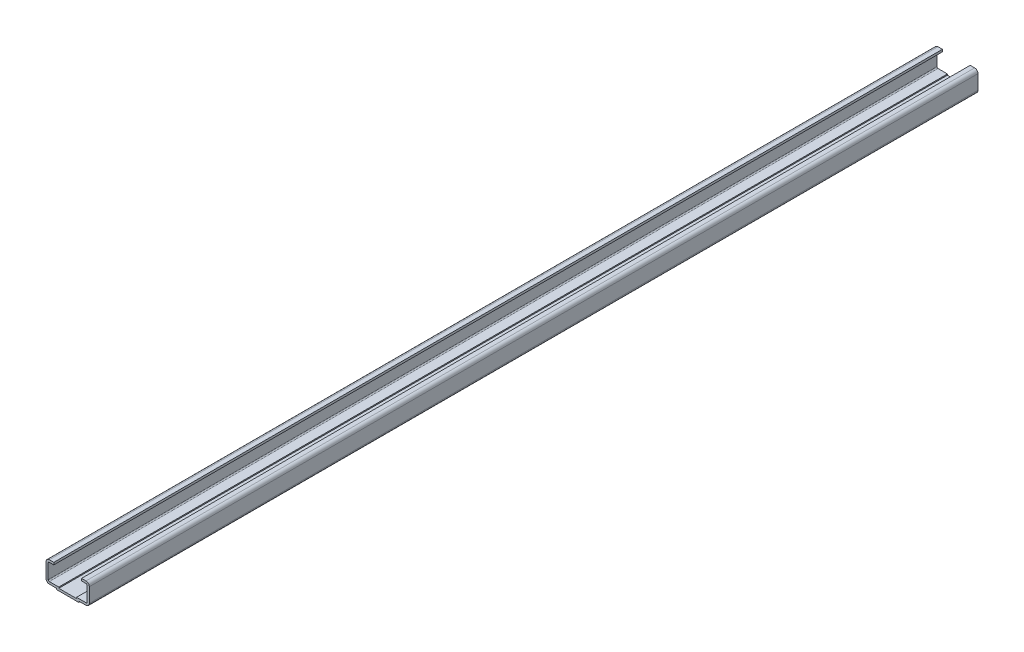
ISO-10303-21;
HEADER;
FILE_DESCRIPTION(('STEP AP214'),'2;1');
FILE_NAME('part.step','',(''),(''),'','','');
FILE_SCHEMA(('AUTOMOTIVE_DESIGN { 1 0 10303 214 1 1 1 1 }'));
ENDSEC;
DATA;
#1=APPLICATION_CONTEXT('core data for automotive mechanical design processes');
#2=APPLICATION_PROTOCOL_DEFINITION('international standard','automotive_design',2000,#1);
#3=PRODUCT_CONTEXT('',#1,'mechanical');
#4=PRODUCT('Part','Part','',(#3));
#5=PRODUCT_RELATED_PRODUCT_CATEGORY('part','',(#4));
#6=PRODUCT_DEFINITION_FORMATION('','',#4);
#7=PRODUCT_DEFINITION_CONTEXT('part definition',#1,'design');
#8=PRODUCT_DEFINITION('design','',#6,#7);
#9=PRODUCT_DEFINITION_SHAPE('','',#8);
#10=(LENGTH_UNIT() NAMED_UNIT(*) SI_UNIT(.MILLI.,.METRE.));
#11=(NAMED_UNIT(*) PLANE_ANGLE_UNIT() SI_UNIT($,.RADIAN.));
#12=(NAMED_UNIT(*) SI_UNIT($,.STERADIAN.) SOLID_ANGLE_UNIT());
#13=UNCERTAINTY_MEASURE_WITH_UNIT(LENGTH_MEASURE(1.E-05),#10,'distance_accuracy_value','');
#14=(GEOMETRIC_REPRESENTATION_CONTEXT(3) GLOBAL_UNCERTAINTY_ASSIGNED_CONTEXT((#13)) GLOBAL_UNIT_ASSIGNED_CONTEXT((#10,
#11,#12)) REPRESENTATION_CONTEXT('',''));
#15=CARTESIAN_POINT('',(0.,0.,0.));
#16=DIRECTION('',(0.,0.,1.));
#17=DIRECTION('',(1.,0.,0.));
#18=AXIS2_PLACEMENT_3D('',#15,#16,#17);
#19=CARTESIAN_POINT('',(9.75,10.,400.));
#20=DIRECTION('',(0.,-1.,0.));
#21=DIRECTION('',(0.,0.,-1.));
#22=AXIS2_PLACEMENT_3D('',#19,#20,#21);
#23=PLANE('',#22);
#24=DIRECTION('',(-1.,0.,0.));
#25=VECTOR('',#24,1.);
#26=CARTESIAN_POINT('',(9.75,10.,400.));
#27=LINE('',#26,#25);
#28=CARTESIAN_POINT('',(8.25,10.,400.));
#29=VERTEX_POINT('',#28);
#30=CARTESIAN_POINT('',(6.25,10.,400.));
#31=VERTEX_POINT('',#30);
#32=EDGE_CURVE('E287',#29,#31,#27,.T.);
#33=ORIENTED_EDGE('',*,*,#32,.F.);
#34=DIRECTION('',(0.,0.,-1.));
#35=VECTOR('',#34,1.);
#36=CARTESIAN_POINT('',(8.25,10.,400.));
#37=LINE('',#36,#35);
#38=CARTESIAN_POINT('',(8.25,10.,0.));
#39=VERTEX_POINT('',#38);
#40=EDGE_CURVE('E222',#29,#39,#37,.T.);
#41=ORIENTED_EDGE('',*,*,#40,.T.);
#42=DIRECTION('',(-1.,0.,0.));
#43=VECTOR('',#42,1.);
#44=CARTESIAN_POINT('',(9.75,10.,0.));
#45=LINE('',#44,#43);
#46=CARTESIAN_POINT('',(6.25,10.,0.));
#47=VERTEX_POINT('',#46);
#48=EDGE_CURVE('E216',#39,#47,#45,.T.);
#49=ORIENTED_EDGE('',*,*,#48,.T.);
#50=DIRECTION('',(0.,0.,-1.));
#51=VECTOR('',#50,1.);
#52=CARTESIAN_POINT('',(6.25,10.,400.));
#53=LINE('',#52,#51);
#54=EDGE_CURVE('E219',#31,#47,#53,.T.);
#55=ORIENTED_EDGE('',*,*,#54,.F.);
#56=EDGE_LOOP('',(#33,#41,#49,#55));
#57=FACE_BOUND('',#56,.T.);
#58=ADVANCED_FACE('F33',(#57),#23,.F.);
#59=CARTESIAN_POINT('',(6.25,9.,400.));
#60=DIRECTION('',(-1.,0.,0.));
#61=DIRECTION('',(0.,0.,1.));
#62=AXIS2_PLACEMENT_3D('',#59,#60,#61);
#63=PLANE('',#62);
#64=DIRECTION('',(0.,1.,0.));
#65=VECTOR('',#64,1.);
#66=CARTESIAN_POINT('',(6.25,9.,0.));
#67=LINE('',#66,#65);
#68=CARTESIAN_POINT('',(6.25,9.,0.));
#69=VERTEX_POINT('',#68);
#70=EDGE_CURVE('E224',#69,#47,#67,.T.);
#71=ORIENTED_EDGE('',*,*,#70,.F.);
#72=DIRECTION('',(0.,0.,-1.));
#73=VECTOR('',#72,1.);
#74=CARTESIAN_POINT('',(6.25,9.,400.));
#75=LINE('',#74,#73);
#76=CARTESIAN_POINT('',(6.25,9.,400.));
#77=VERTEX_POINT('',#76);
#78=EDGE_CURVE('E233',#77,#69,#75,.T.);
#79=ORIENTED_EDGE('',*,*,#78,.F.);
#80=DIRECTION('',(0.,1.,0.));
#81=VECTOR('',#80,1.);
#82=CARTESIAN_POINT('',(6.25,9.,400.));
#83=LINE('',#82,#81);
#84=EDGE_CURVE('E231',#77,#31,#83,.T.);
#85=ORIENTED_EDGE('',*,*,#84,.T.);
#86=ORIENTED_EDGE('',*,*,#54,.T.);
#87=EDGE_LOOP('',(#71,#79,#85,#86));
#88=FACE_BOUND('',#87,.T.);
#89=ADVANCED_FACE('F228',(#88),#63,.T.);
#90=CARTESIAN_POINT('',(9.75,9.,400.));
#91=DIRECTION('',(0.,-1.,0.));
#92=DIRECTION('',(0.,0.,-1.));
#93=AXIS2_PLACEMENT_3D('',#90,#91,#92);
#94=PLANE('',#93);
#95=DIRECTION('',(1.,0.,0.));
#96=VECTOR('',#95,1.);
#97=CARTESIAN_POINT('',(9.75,9.,0.));
#98=LINE('',#97,#96);
#99=CARTESIAN_POINT('',(8.25,9.,0.));
#100=VERTEX_POINT('',#99);
#101=EDGE_CURVE('E237',#100,#69,#98,.F.);
#102=ORIENTED_EDGE('',*,*,#101,.F.);
#103=DIRECTION('',(0.,0.,-1.));
#104=VECTOR('',#103,1.);
#105=CARTESIAN_POINT('',(8.25,9.,400.));
#106=LINE('',#105,#104);
#107=CARTESIAN_POINT('',(8.25,9.,400.));
#108=VERTEX_POINT('',#107);
#109=EDGE_CURVE('E47',#100,#108,#106,.F.);
#110=ORIENTED_EDGE('',*,*,#109,.T.);
#111=DIRECTION('',(1.,0.,0.));
#112=VECTOR('',#111,1.);
#113=CARTESIAN_POINT('',(9.75,9.,400.));
#114=LINE('',#113,#112);
#115=EDGE_CURVE('E290',#108,#77,#114,.F.);
#116=ORIENTED_EDGE('',*,*,#115,.T.);
#117=ORIENTED_EDGE('',*,*,#78,.T.);
#118=EDGE_LOOP('',(#102,#110,#116,#117));
#119=FACE_BOUND('',#118,.T.);
#120=ADVANCED_FACE('F492',(#119),#94,.T.);
#121=CARTESIAN_POINT('',(8.75,0.5,400.));
#122=DIRECTION('',(-1.,0.,0.));
#123=DIRECTION('',(0.,0.,1.));
#124=AXIS2_PLACEMENT_3D('',#121,#122,#123);
#125=PLANE('',#124);
#126=DIRECTION('',(0.,1.,0.));
#127=VECTOR('',#126,1.);
#128=CARTESIAN_POINT('',(8.75,0.5,0.));
#129=LINE('',#128,#127);
#130=CARTESIAN_POINT('',(8.75,2.,0.));
#131=VERTEX_POINT('',#130);
#132=CARTESIAN_POINT('',(8.75,8.5,0.));
#133=VERTEX_POINT('',#132);
#134=EDGE_CURVE('E240',#131,#133,#129,.T.);
#135=ORIENTED_EDGE('',*,*,#134,.F.);
#136=DIRECTION('',(0.,0.,-1.));
#137=VECTOR('',#136,1.);
#138=CARTESIAN_POINT('',(8.75,2.,400.));
#139=LINE('',#138,#137);
#140=CARTESIAN_POINT('',(8.75,2.,400.));
#141=VERTEX_POINT('',#140);
#142=EDGE_CURVE('E410',#131,#141,#139,.F.);
#143=ORIENTED_EDGE('',*,*,#142,.T.);
#144=DIRECTION('',(0.,1.,0.));
#145=VECTOR('',#144,1.);
#146=CARTESIAN_POINT('',(8.75,0.5,400.));
#147=LINE('',#146,#145);
#148=CARTESIAN_POINT('',(8.75,8.5,400.));
#149=VERTEX_POINT('',#148);
#150=EDGE_CURVE('E292',#141,#149,#147,.T.);
#151=ORIENTED_EDGE('',*,*,#150,.T.);
#152=DIRECTION('',(0.,0.,-1.));
#153=VECTOR('',#152,1.);
#154=CARTESIAN_POINT('',(8.75,8.5,0.));
#155=LINE('',#154,#153);
#156=EDGE_CURVE('E407',#149,#133,#155,.T.);
#157=ORIENTED_EDGE('',*,*,#156,.T.);
#158=EDGE_LOOP('',(#135,#143,#151,#157));
#159=FACE_BOUND('',#158,.T.);
#160=ADVANCED_FACE('F474',(#159),#125,.T.);
#161=CARTESIAN_POINT('',(9.75,1.5,400.));
#162=DIRECTION('',(0.,1.,0.));
#163=DIRECTION('',(-1.,0.,0.));
#164=AXIS2_PLACEMENT_3D('',#161,#162,#163);
#165=PLANE('',#164);
#166=DIRECTION('',(1.,0.,0.));
#167=VECTOR('',#166,1.);
#168=CARTESIAN_POINT('',(9.75,1.5,400.));
#169=LINE('',#168,#167);
#170=CARTESIAN_POINT('',(4.,1.5,400.));
#171=VERTEX_POINT('',#170);
#172=CARTESIAN_POINT('',(8.25,1.5,400.));
#173=VERTEX_POINT('',#172);
#174=EDGE_CURVE('E295',#171,#173,#169,.T.);
#175=ORIENTED_EDGE('',*,*,#174,.T.);
#176=DIRECTION('',(0.,0.,-1.));
#177=VECTOR('',#176,1.);
#178=CARTESIAN_POINT('',(8.25,1.5,0.));
#179=LINE('',#178,#177);
#180=CARTESIAN_POINT('',(8.25,1.5,0.));
#181=VERTEX_POINT('',#180);
#182=EDGE_CURVE('E404',#173,#181,#179,.T.);
#183=ORIENTED_EDGE('',*,*,#182,.T.);
#184=DIRECTION('',(1.,0.,0.));
#185=VECTOR('',#184,1.);
#186=CARTESIAN_POINT('',(9.75,1.5,0.));
#187=LINE('',#186,#185);
#188=CARTESIAN_POINT('',(4.,1.5,0.));
#189=VERTEX_POINT('',#188);
#190=EDGE_CURVE('E244',#189,#181,#187,.T.);
#191=ORIENTED_EDGE('',*,*,#190,.F.);
#192=DIRECTION('',(0.,0.,-1.));
#193=VECTOR('',#192,1.);
#194=CARTESIAN_POINT('',(4.,1.5,400.));
#195=LINE('',#194,#193);
#196=EDGE_CURVE('E361',#171,#189,#195,.T.);
#197=ORIENTED_EDGE('',*,*,#196,.F.);
#198=EDGE_LOOP('',(#175,#183,#191,#197));
#199=FACE_BOUND('',#198,.T.);
#200=ADVANCED_FACE('F468',(#199),#165,.T.);
#201=CARTESIAN_POINT('',(4.,0.,400.));
#202=DIRECTION('',(-1.,0.,0.));
#203=DIRECTION('',(0.,0.,1.));
#204=AXIS2_PLACEMENT_3D('',#201,#202,#203);
#205=PLANE('',#204);
#206=DIRECTION('',(0.,1.,0.));
#207=VECTOR('',#206,1.);
#208=CARTESIAN_POINT('',(4.,0.,0.));
#209=LINE('',#208,#207);
#210=CARTESIAN_POINT('',(4.,1.,0.));
#211=VERTEX_POINT('',#210);
#212=EDGE_CURVE('E247',#211,#189,#209,.T.);
#213=ORIENTED_EDGE('',*,*,#212,.F.);
#214=DIRECTION('',(0.,0.,-1.));
#215=VECTOR('',#214,1.);
#216=CARTESIAN_POINT('',(4.,1.,400.));
#217=LINE('',#216,#215);
#218=CARTESIAN_POINT('',(4.,1.,400.));
#219=VERTEX_POINT('',#218);
#220=EDGE_CURVE('E359',#219,#211,#217,.T.);
#221=ORIENTED_EDGE('',*,*,#220,.F.);
#222=DIRECTION('',(0.,1.,0.));
#223=VECTOR('',#222,1.);
#224=CARTESIAN_POINT('',(4.,0.,400.));
#225=LINE('',#224,#223);
#226=EDGE_CURVE('E298',#219,#171,#225,.T.);
#227=ORIENTED_EDGE('',*,*,#226,.T.);
#228=ORIENTED_EDGE('',*,*,#196,.T.);
#229=EDGE_LOOP('',(#213,#221,#227,#228));
#230=FACE_BOUND('',#229,.T.);
#231=ADVANCED_FACE('F464',(#230),#205,.T.);
#232=CARTESIAN_POINT('',(-5.,1.,400.));
#233=DIRECTION('',(0.,1.,0.));
#234=DIRECTION('',(0.,0.,1.));
#235=AXIS2_PLACEMENT_3D('',#232,#233,#234);
#236=PLANE('',#235);
#237=DIRECTION('',(1.,0.,0.));
#238=VECTOR('',#237,1.);
#239=CARTESIAN_POINT('',(-5.,1.,0.));
#240=LINE('',#239,#238);
#241=CARTESIAN_POINT('',(-4.,1.,0.));
#242=VERTEX_POINT('',#241);
#243=EDGE_CURVE('E250',#242,#211,#240,.T.);
#244=ORIENTED_EDGE('',*,*,#243,.F.);
#245=DIRECTION('',(0.,0.,-1.));
#246=VECTOR('',#245,1.);
#247=CARTESIAN_POINT('',(-4.,1.,400.));
#248=LINE('',#247,#246);
#249=CARTESIAN_POINT('',(-4.,1.,400.));
#250=VERTEX_POINT('',#249);
#251=EDGE_CURVE('E357',#250,#242,#248,.T.);
#252=ORIENTED_EDGE('',*,*,#251,.F.);
#253=DIRECTION('',(1.,0.,0.));
#254=VECTOR('',#253,1.);
#255=CARTESIAN_POINT('',(-5.,1.,400.));
#256=LINE('',#255,#254);
#257=EDGE_CURVE('E301',#250,#219,#256,.T.);
#258=ORIENTED_EDGE('',*,*,#257,.T.);
#259=ORIENTED_EDGE('',*,*,#220,.T.);
#260=EDGE_LOOP('',(#244,#252,#258,#259));
#261=FACE_BOUND('',#260,.T.);
#262=ADVANCED_FACE('F460',(#261),#236,.T.);
#263=CARTESIAN_POINT('',(-4.,0.,400.));
#264=DIRECTION('',(1.,0.,0.));
#265=DIRECTION('',(0.,0.,-1.));
#266=AXIS2_PLACEMENT_3D('',#263,#264,#265);
#267=PLANE('',#266);
#268=DIRECTION('',(0.,1.,0.));
#269=VECTOR('',#268,1.);
#270=CARTESIAN_POINT('',(-4.,0.,0.));
#271=LINE('',#270,#269);
#272=CARTESIAN_POINT('',(-4.,1.5,0.));
#273=VERTEX_POINT('',#272);
#274=EDGE_CURVE('E253',#273,#242,#271,.F.);
#275=ORIENTED_EDGE('',*,*,#274,.F.);
#276=DIRECTION('',(0.,0.,-1.));
#277=VECTOR('',#276,1.);
#278=CARTESIAN_POINT('',(-4.,1.5,400.));
#279=LINE('',#278,#277);
#280=CARTESIAN_POINT('',(-4.,1.5,400.));
#281=VERTEX_POINT('',#280);
#282=EDGE_CURVE('E354',#281,#273,#279,.T.);
#283=ORIENTED_EDGE('',*,*,#282,.F.);
#284=DIRECTION('',(0.,1.,0.));
#285=VECTOR('',#284,1.);
#286=CARTESIAN_POINT('',(-4.,0.,400.));
#287=LINE('',#286,#285);
#288=EDGE_CURVE('E304',#281,#250,#287,.F.);
#289=ORIENTED_EDGE('',*,*,#288,.T.);
#290=ORIENTED_EDGE('',*,*,#251,.T.);
#291=EDGE_LOOP('',(#275,#283,#289,#290));
#292=FACE_BOUND('',#291,.T.);
#293=ADVANCED_FACE('F456',(#292),#267,.T.);
#294=CARTESIAN_POINT('',(-9.75,1.5,400.));
#295=DIRECTION('',(0.,1.,0.));
#296=DIRECTION('',(-1.,0.,0.));
#297=AXIS2_PLACEMENT_3D('',#294,#295,#296);
#298=PLANE('',#297);
#299=DIRECTION('',(1.,0.,0.));
#300=VECTOR('',#299,1.);
#301=CARTESIAN_POINT('',(-9.75,1.5,0.));
#302=LINE('',#301,#300);
#303=CARTESIAN_POINT('',(-8.25,1.5,0.));
#304=VERTEX_POINT('',#303);
#305=EDGE_CURVE('E256',#304,#273,#302,.T.);
#306=ORIENTED_EDGE('',*,*,#305,.F.);
#307=DIRECTION('',(0.,0.,-1.));
#308=VECTOR('',#307,1.);
#309=CARTESIAN_POINT('',(-8.25,1.5,400.));
#310=LINE('',#309,#308);
#311=CARTESIAN_POINT('',(-8.25,1.5,400.));
#312=VERTEX_POINT('',#311);
#313=EDGE_CURVE('E402',#304,#312,#310,.F.);
#314=ORIENTED_EDGE('',*,*,#313,.T.);
#315=DIRECTION('',(1.,0.,0.));
#316=VECTOR('',#315,1.);
#317=CARTESIAN_POINT('',(-9.75,1.5,400.));
#318=LINE('',#317,#316);
#319=EDGE_CURVE('E307',#312,#281,#318,.T.);
#320=ORIENTED_EDGE('',*,*,#319,.T.);
#321=ORIENTED_EDGE('',*,*,#282,.T.);
#322=EDGE_LOOP('',(#306,#314,#320,#321));
#323=FACE_BOUND('',#322,.T.);
#324=ADVANCED_FACE('F450',(#323),#298,.T.);
#325=CARTESIAN_POINT('',(-8.75,0.5,400.));
#326=DIRECTION('',(1.,0.,0.));
#327=DIRECTION('',(0.,0.,-1.));
#328=AXIS2_PLACEMENT_3D('',#325,#326,#327);
#329=PLANE('',#328);
#330=DIRECTION('',(0.,1.,0.));
#331=VECTOR('',#330,1.);
#332=CARTESIAN_POINT('',(-8.75,0.5,400.));
#333=LINE('',#332,#331);
#334=CARTESIAN_POINT('',(-8.75,8.5,400.));
#335=VERTEX_POINT('',#334);
#336=CARTESIAN_POINT('',(-8.75,2.,400.));
#337=VERTEX_POINT('',#336);
#338=EDGE_CURVE('E309',#335,#337,#333,.F.);
#339=ORIENTED_EDGE('',*,*,#338,.T.);
#340=DIRECTION('',(0.,0.,-1.));
#341=VECTOR('',#340,1.);
#342=CARTESIAN_POINT('',(-8.75,2.,0.));
#343=LINE('',#342,#341);
#344=CARTESIAN_POINT('',(-8.75,2.,0.));
#345=VERTEX_POINT('',#344);
#346=EDGE_CURVE('E399',#337,#345,#343,.T.);
#347=ORIENTED_EDGE('',*,*,#346,.T.);
#348=DIRECTION('',(0.,1.,0.));
#349=VECTOR('',#348,1.);
#350=CARTESIAN_POINT('',(-8.75,0.5,0.));
#351=LINE('',#350,#349);
#352=CARTESIAN_POINT('',(-8.75,8.5,0.));
#353=VERTEX_POINT('',#352);
#354=EDGE_CURVE('E258',#353,#345,#351,.F.);
#355=ORIENTED_EDGE('',*,*,#354,.F.);
#356=DIRECTION('',(0.,0.,-1.));
#357=VECTOR('',#356,1.);
#358=CARTESIAN_POINT('',(-8.75,8.5,400.));
#359=LINE('',#358,#357);
#360=EDGE_CURVE('E397',#353,#335,#359,.F.);
#361=ORIENTED_EDGE('',*,*,#360,.T.);
#362=EDGE_LOOP('',(#339,#347,#355,#361));
#363=FACE_BOUND('',#362,.T.);
#364=ADVANCED_FACE('F442',(#363),#329,.T.);
#365=CARTESIAN_POINT('',(-9.75,9.,400.));
#366=DIRECTION('',(0.,-1.,0.));
#367=DIRECTION('',(0.,0.,-1.));
#368=AXIS2_PLACEMENT_3D('',#365,#366,#367);
#369=PLANE('',#368);
#370=DIRECTION('',(1.,0.,0.));
#371=VECTOR('',#370,1.);
#372=CARTESIAN_POINT('',(-9.75,9.,400.));
#373=LINE('',#372,#371);
#374=CARTESIAN_POINT('',(-6.25,9.,400.));
#375=VERTEX_POINT('',#374);
#376=CARTESIAN_POINT('',(-8.25,9.,400.));
#377=VERTEX_POINT('',#376);
#378=EDGE_CURVE('E312',#375,#377,#373,.F.);
#379=ORIENTED_EDGE('',*,*,#378,.T.);
#380=DIRECTION('',(0.,0.,-1.));
#381=VECTOR('',#380,1.);
#382=CARTESIAN_POINT('',(-8.25,9.,0.));
#383=LINE('',#382,#381);
#384=CARTESIAN_POINT('',(-8.25,9.,0.));
#385=VERTEX_POINT('',#384);
#386=EDGE_CURVE('E412',#377,#385,#383,.T.);
#387=ORIENTED_EDGE('',*,*,#386,.T.);
#388=DIRECTION('',(1.,0.,0.));
#389=VECTOR('',#388,1.);
#390=CARTESIAN_POINT('',(-9.75,9.,0.));
#391=LINE('',#390,#389);
#392=CARTESIAN_POINT('',(-6.25,9.,0.));
#393=VERTEX_POINT('',#392);
#394=EDGE_CURVE('E261',#393,#385,#391,.F.);
#395=ORIENTED_EDGE('',*,*,#394,.F.);
#396=DIRECTION('',(0.,0.,-1.));
#397=VECTOR('',#396,1.);
#398=CARTESIAN_POINT('',(-6.25,9.,400.));
#399=LINE('',#398,#397);
#400=EDGE_CURVE('E352',#375,#393,#399,.T.);
#401=ORIENTED_EDGE('',*,*,#400,.F.);
#402=EDGE_LOOP('',(#379,#387,#395,#401));
#403=FACE_BOUND('',#402,.T.);
#404=ADVANCED_FACE('F437',(#403),#369,.T.);
#405=CARTESIAN_POINT('',(-6.25,10.,400.));
#406=DIRECTION('',(1.,0.,0.));
#407=DIRECTION('',(0.,0.,-1.));
#408=AXIS2_PLACEMENT_3D('',#405,#406,#407);
#409=PLANE('',#408);
#410=DIRECTION('',(0.,-1.,0.));
#411=VECTOR('',#410,1.);
#412=CARTESIAN_POINT('',(-6.25,10.,0.));
#413=LINE('',#412,#411);
#414=CARTESIAN_POINT('',(-6.25,10.,0.));
#415=VERTEX_POINT('',#414);
#416=EDGE_CURVE('E264',#415,#393,#413,.T.);
#417=ORIENTED_EDGE('',*,*,#416,.F.);
#418=DIRECTION('',(0.,0.,-1.));
#419=VECTOR('',#418,1.);
#420=CARTESIAN_POINT('',(-6.25,10.,400.));
#421=LINE('',#420,#419);
#422=CARTESIAN_POINT('',(-6.25,10.,400.));
#423=VERTEX_POINT('',#422);
#424=EDGE_CURVE('E350',#423,#415,#421,.T.);
#425=ORIENTED_EDGE('',*,*,#424,.F.);
#426=DIRECTION('',(0.,-1.,0.));
#427=VECTOR('',#426,1.);
#428=CARTESIAN_POINT('',(-6.25,10.,400.));
#429=LINE('',#428,#427);
#430=EDGE_CURVE('E315',#423,#375,#429,.T.);
#431=ORIENTED_EDGE('',*,*,#430,.T.);
#432=ORIENTED_EDGE('',*,*,#400,.T.);
#433=EDGE_LOOP('',(#417,#425,#431,#432));
#434=FACE_BOUND('',#433,.T.);
#435=ADVANCED_FACE('F514',(#434),#409,.T.);
#436=CARTESIAN_POINT('',(-9.75,10.,400.));
#437=DIRECTION('',(0.,-1.,0.));
#438=DIRECTION('',(0.,0.,-1.));
#439=AXIS2_PLACEMENT_3D('',#436,#437,#438);
#440=PLANE('',#439);
#441=DIRECTION('',(-1.,0.,0.));
#442=VECTOR('',#441,1.);
#443=CARTESIAN_POINT('',(-9.75,10.,0.));
#444=LINE('',#443,#442);
#445=CARTESIAN_POINT('',(-8.25,10.,0.));
#446=VERTEX_POINT('',#445);
#447=EDGE_CURVE('E267',#415,#446,#444,.T.);
#448=ORIENTED_EDGE('',*,*,#447,.T.);
#449=DIRECTION('',(0.,0.,-1.));
#450=VECTOR('',#449,1.);
#451=CARTESIAN_POINT('',(-8.25,10.,400.));
#452=LINE('',#451,#450);
#453=CARTESIAN_POINT('',(-8.25,10.,400.));
#454=VERTEX_POINT('',#453);
#455=EDGE_CURVE('E387',#446,#454,#452,.F.);
#456=ORIENTED_EDGE('',*,*,#455,.T.);
#457=DIRECTION('',(-1.,0.,0.));
#458=VECTOR('',#457,1.);
#459=CARTESIAN_POINT('',(-9.75,10.,400.));
#460=LINE('',#459,#458);
#461=EDGE_CURVE('E318',#423,#454,#460,.T.);
#462=ORIENTED_EDGE('',*,*,#461,.F.);
#463=ORIENTED_EDGE('',*,*,#424,.T.);
#464=EDGE_LOOP('',(#448,#456,#462,#463));
#465=FACE_BOUND('',#464,.T.);
#466=ADVANCED_FACE('F517',(#465),#440,.F.);
#467=CARTESIAN_POINT('',(-9.75,0.5,400.));
#468=DIRECTION('',(1.,0.,0.));
#469=DIRECTION('',(0.,0.,-1.));
#470=AXIS2_PLACEMENT_3D('',#467,#468,#469);
#471=PLANE('',#470);
#472=DIRECTION('',(0.,-1.,0.));
#473=VECTOR('',#472,1.);
#474=CARTESIAN_POINT('',(-9.75,0.5,0.));
#475=LINE('',#474,#473);
#476=CARTESIAN_POINT('',(-9.75,8.5,0.));
#477=VERTEX_POINT('',#476);
#478=CARTESIAN_POINT('',(-9.75,2.,0.));
#479=VERTEX_POINT('',#478);
#480=EDGE_CURVE('E270',#477,#479,#475,.T.);
#481=ORIENTED_EDGE('',*,*,#480,.T.);
#482=DIRECTION('',(0.,0.,-1.));
#483=VECTOR('',#482,1.);
#484=CARTESIAN_POINT('',(-9.75,2.,400.));
#485=LINE('',#484,#483);
#486=CARTESIAN_POINT('',(-9.75,2.,400.));
#487=VERTEX_POINT('',#486);
#488=EDGE_CURVE('E377',#479,#487,#485,.F.);
#489=ORIENTED_EDGE('',*,*,#488,.T.);
#490=DIRECTION('',(0.,-1.,0.));
#491=VECTOR('',#490,1.);
#492=CARTESIAN_POINT('',(-9.75,0.5,400.));
#493=LINE('',#492,#491);
#494=CARTESIAN_POINT('',(-9.75,8.5,400.));
#495=VERTEX_POINT('',#494);
#496=EDGE_CURVE('E321',#495,#487,#493,.T.);
#497=ORIENTED_EDGE('',*,*,#496,.F.);
#498=DIRECTION('',(0.,0.,-1.));
#499=VECTOR('',#498,1.);
#500=CARTESIAN_POINT('',(-9.75,8.5,400.));
#501=LINE('',#500,#499);
#502=EDGE_CURVE('E374',#495,#477,#501,.T.);
#503=ORIENTED_EDGE('',*,*,#502,.T.);
#504=EDGE_LOOP('',(#481,#489,#497,#503));
#505=FACE_BOUND('',#504,.T.);
#506=ADVANCED_FACE('F521',(#505),#471,.F.);
#507=CARTESIAN_POINT('',(-9.75,0.5,400.));
#508=DIRECTION('',(0.,1.,0.));
#509=DIRECTION('',(-1.,0.,0.));
#510=AXIS2_PLACEMENT_3D('',#507,#508,#509);
#511=PLANE('',#510);
#512=DIRECTION('',(1.,0.,0.));
#513=VECTOR('',#512,1.);
#514=CARTESIAN_POINT('',(-9.75,0.5,400.));
#515=LINE('',#514,#513);
#516=CARTESIAN_POINT('',(-8.25,0.5,400.));
#517=VERTEX_POINT('',#516);
#518=CARTESIAN_POINT('',(-5.,0.499999999999999,400.));
#519=VERTEX_POINT('',#518);
#520=EDGE_CURVE('E324',#517,#519,#515,.T.);
#521=ORIENTED_EDGE('',*,*,#520,.F.);
#522=DIRECTION('',(0.,0.,-1.));
#523=VECTOR('',#522,1.);
#524=CARTESIAN_POINT('',(-8.25,0.5,400.));
#525=LINE('',#524,#523);
#526=CARTESIAN_POINT('',(-8.25,0.5,0.));
#527=VERTEX_POINT('',#526);
#528=EDGE_CURVE('E232',#517,#527,#525,.T.);
#529=ORIENTED_EDGE('',*,*,#528,.T.);
#530=DIRECTION('',(1.,0.,0.));
#531=VECTOR('',#530,1.);
#532=CARTESIAN_POINT('',(-9.75,0.5,0.));
#533=LINE('',#532,#531);
#534=CARTESIAN_POINT('',(-5.,0.499999999999999,0.));
#535=VERTEX_POINT('',#534);
#536=EDGE_CURVE('E273',#527,#535,#533,.T.);
#537=ORIENTED_EDGE('',*,*,#536,.T.);
#538=DIRECTION('',(0.,0.,-1.));
#539=VECTOR('',#538,1.);
#540=CARTESIAN_POINT('',(-5.,0.499999999999999,400.));
#541=LINE('',#540,#539);
#542=EDGE_CURVE('E347',#519,#535,#541,.T.);
#543=ORIENTED_EDGE('',*,*,#542,.F.);
#544=EDGE_LOOP('',(#521,#529,#537,#543));
#545=FACE_BOUND('',#544,.T.);
#546=ADVANCED_FACE('F525',(#545),#511,.F.);
#547=CARTESIAN_POINT('',(-5.,0.,400.));
#548=DIRECTION('',(1.,0.,0.));
#549=DIRECTION('',(0.,0.,-1.));
#550=AXIS2_PLACEMENT_3D('',#547,#548,#549);
#551=PLANE('',#550);
#552=DIRECTION('',(0.,-1.,0.));
#553=VECTOR('',#552,1.);
#554=CARTESIAN_POINT('',(-5.,0.,0.));
#555=LINE('',#554,#553);
#556=CARTESIAN_POINT('',(-5.,0.,0.));
#557=VERTEX_POINT('',#556);
#558=EDGE_CURVE('E275',#535,#557,#555,.T.);
#559=ORIENTED_EDGE('',*,*,#558,.T.);
#560=DIRECTION('',(0.,0.,-1.));
#561=VECTOR('',#560,1.);
#562=CARTESIAN_POINT('',(-5.,0.,400.));
#563=LINE('',#562,#561);
#564=CARTESIAN_POINT('',(-5.,0.,400.));
#565=VERTEX_POINT('',#564);
#566=EDGE_CURVE('E344',#565,#557,#563,.T.);
#567=ORIENTED_EDGE('',*,*,#566,.F.);
#568=DIRECTION('',(0.,-1.,0.));
#569=VECTOR('',#568,1.);
#570=CARTESIAN_POINT('',(-5.,0.,400.));
#571=LINE('',#570,#569);
#572=EDGE_CURVE('E326',#519,#565,#571,.T.);
#573=ORIENTED_EDGE('',*,*,#572,.F.);
#574=ORIENTED_EDGE('',*,*,#542,.T.);
#575=EDGE_LOOP('',(#559,#567,#573,#574));
#576=FACE_BOUND('',#575,.T.);
#577=ADVANCED_FACE('F529',(#576),#551,.F.);
#578=CARTESIAN_POINT('',(-5.,0.,400.));
#579=DIRECTION('',(0.,1.,0.));
#580=DIRECTION('',(0.,0.,1.));
#581=AXIS2_PLACEMENT_3D('',#578,#579,#580);
#582=PLANE('',#581);
#583=DIRECTION('',(1.,0.,0.));
#584=VECTOR('',#583,1.);
#585=CARTESIAN_POINT('',(-5.,0.,0.));
#586=LINE('',#585,#584);
#587=CARTESIAN_POINT('',(5.,0.,0.));
#588=VERTEX_POINT('',#587);
#589=EDGE_CURVE('E277',#557,#588,#586,.T.);
#590=ORIENTED_EDGE('',*,*,#589,.T.);
#591=DIRECTION('',(0.,0.,-1.));
#592=VECTOR('',#591,1.);
#593=CARTESIAN_POINT('',(5.,0.,400.));
#594=LINE('',#593,#592);
#595=CARTESIAN_POINT('',(5.,0.,400.));
#596=VERTEX_POINT('',#595);
#597=EDGE_CURVE('E341',#596,#588,#594,.T.);
#598=ORIENTED_EDGE('',*,*,#597,.F.);
#599=DIRECTION('',(1.,0.,0.));
#600=VECTOR('',#599,1.);
#601=CARTESIAN_POINT('',(-5.,0.,400.));
#602=LINE('',#601,#600);
#603=EDGE_CURVE('E328',#565,#596,#602,.T.);
#604=ORIENTED_EDGE('',*,*,#603,.F.);
#605=ORIENTED_EDGE('',*,*,#566,.T.);
#606=EDGE_LOOP('',(#590,#598,#604,#605));
#607=FACE_BOUND('',#606,.T.);
#608=ADVANCED_FACE('F533',(#607),#582,.F.);
#609=CARTESIAN_POINT('',(5.,0.,400.));
#610=DIRECTION('',(-1.,0.,0.));
#611=DIRECTION('',(0.,0.,1.));
#612=AXIS2_PLACEMENT_3D('',#609,#610,#611);
#613=PLANE('',#612);
#614=DIRECTION('',(0.,1.,0.));
#615=VECTOR('',#614,1.);
#616=CARTESIAN_POINT('',(5.,0.,0.));
#617=LINE('',#616,#615);
#618=CARTESIAN_POINT('',(5.,0.499999999999999,0.));
#619=VERTEX_POINT('',#618);
#620=EDGE_CURVE('E279',#588,#619,#617,.T.);
#621=ORIENTED_EDGE('',*,*,#620,.T.);
#622=DIRECTION('',(0.,0.,-1.));
#623=VECTOR('',#622,1.);
#624=CARTESIAN_POINT('',(5.,0.499999999999999,400.));
#625=LINE('',#624,#623);
#626=CARTESIAN_POINT('',(5.,0.499999999999999,400.));
#627=VERTEX_POINT('',#626);
#628=EDGE_CURVE('E338',#627,#619,#625,.T.);
#629=ORIENTED_EDGE('',*,*,#628,.F.);
#630=DIRECTION('',(0.,1.,0.));
#631=VECTOR('',#630,1.);
#632=CARTESIAN_POINT('',(5.,0.,400.));
#633=LINE('',#632,#631);
#634=EDGE_CURVE('E330',#596,#627,#633,.T.);
#635=ORIENTED_EDGE('',*,*,#634,.F.);
#636=ORIENTED_EDGE('',*,*,#597,.T.);
#637=EDGE_LOOP('',(#621,#629,#635,#636));
#638=FACE_BOUND('',#637,.T.);
#639=ADVANCED_FACE('F537',(#638),#613,.F.);
#640=CARTESIAN_POINT('',(9.75,0.5,400.));
#641=DIRECTION('',(0.,1.,0.));
#642=DIRECTION('',(-1.,0.,0.));
#643=AXIS2_PLACEMENT_3D('',#640,#641,#642);
#644=PLANE('',#643);
#645=DIRECTION('',(1.,0.,0.));
#646=VECTOR('',#645,1.);
#647=CARTESIAN_POINT('',(9.75,0.5,0.));
#648=LINE('',#647,#646);
#649=CARTESIAN_POINT('',(8.25,0.5,0.));
#650=VERTEX_POINT('',#649);
#651=EDGE_CURVE('E281',#619,#650,#648,.T.);
#652=ORIENTED_EDGE('',*,*,#651,.T.);
#653=DIRECTION('',(0.,0.,-1.));
#654=VECTOR('',#653,1.);
#655=CARTESIAN_POINT('',(8.25,0.5,400.));
#656=LINE('',#655,#654);
#657=CARTESIAN_POINT('',(8.25,0.5,400.));
#658=VERTEX_POINT('',#657);
#659=EDGE_CURVE('E394',#650,#658,#656,.F.);
#660=ORIENTED_EDGE('',*,*,#659,.T.);
#661=DIRECTION('',(1.,0.,0.));
#662=VECTOR('',#661,1.);
#663=CARTESIAN_POINT('',(9.75,0.5,400.));
#664=LINE('',#663,#662);
#665=EDGE_CURVE('E332',#627,#658,#664,.T.);
#666=ORIENTED_EDGE('',*,*,#665,.F.);
#667=ORIENTED_EDGE('',*,*,#628,.T.);
#668=EDGE_LOOP('',(#652,#660,#666,#667));
#669=FACE_BOUND('',#668,.T.);
#670=ADVANCED_FACE('F541',(#669),#644,.F.);
#671=CARTESIAN_POINT('',(9.75,0.5,400.));
#672=DIRECTION('',(-1.,0.,0.));
#673=DIRECTION('',(0.,0.,1.));
#674=AXIS2_PLACEMENT_3D('',#671,#672,#673);
#675=PLANE('',#674);
#676=DIRECTION('',(0.,1.,0.));
#677=VECTOR('',#676,1.);
#678=CARTESIAN_POINT('',(9.75,0.5,400.));
#679=LINE('',#678,#677);
#680=CARTESIAN_POINT('',(9.75,2.,400.));
#681=VERTEX_POINT('',#680);
#682=CARTESIAN_POINT('',(9.75,8.5,400.));
#683=VERTEX_POINT('',#682);
#684=EDGE_CURVE('E335',#681,#683,#679,.T.);
#685=ORIENTED_EDGE('',*,*,#684,.F.);
#686=DIRECTION('',(0.,0.,-1.));
#687=VECTOR('',#686,1.);
#688=CARTESIAN_POINT('',(9.75,2.,400.));
#689=LINE('',#688,#687);
#690=CARTESIAN_POINT('',(9.75,2.,0.));
#691=VERTEX_POINT('',#690);
#692=EDGE_CURVE('E391',#681,#691,#689,.T.);
#693=ORIENTED_EDGE('',*,*,#692,.T.);
#694=DIRECTION('',(0.,1.,0.));
#695=VECTOR('',#694,1.);
#696=CARTESIAN_POINT('',(9.75,0.5,0.));
#697=LINE('',#696,#695);
#698=CARTESIAN_POINT('',(9.75,8.5,0.));
#699=VERTEX_POINT('',#698);
#700=EDGE_CURVE('E284',#691,#699,#697,.T.);
#701=ORIENTED_EDGE('',*,*,#700,.T.);
#702=DIRECTION('',(0.,0.,-1.));
#703=VECTOR('',#702,1.);
#704=CARTESIAN_POINT('',(9.75,8.5,400.));
#705=LINE('',#704,#703);
#706=EDGE_CURVE('E389',#699,#683,#705,.F.);
#707=ORIENTED_EDGE('',*,*,#706,.T.);
#708=EDGE_LOOP('',(#685,#693,#701,#707));
#709=FACE_BOUND('',#708,.T.);
#710=ADVANCED_FACE('F545',(#709),#675,.F.);
#711=CARTESIAN_POINT('',(6.25,10.,400.));
#712=DIRECTION('',(0.,0.,-1.));
#713=DIRECTION('',(-1.,0.,0.));
#714=AXIS2_PLACEMENT_3D('',#711,#712,#713);
#715=PLANE('',#714);
#716=ORIENTED_EDGE('',*,*,#496,.T.);
#717=CARTESIAN_POINT('',(-8.25,2.,400.));
#718=DIRECTION('',(0.,0.,-1.));
#719=DIRECTION('',(-1.,0.,0.));
#720=AXIS2_PLACEMENT_3D('',#717,#718,#719);
#721=CIRCLE('',#720,1.5);
#722=EDGE_CURVE('E385',#487,#517,#721,.F.);
#723=ORIENTED_EDGE('',*,*,#722,.T.);
#724=ORIENTED_EDGE('',*,*,#520,.T.);
#725=ORIENTED_EDGE('',*,*,#572,.T.);
#726=ORIENTED_EDGE('',*,*,#603,.T.);
#727=ORIENTED_EDGE('',*,*,#634,.T.);
#728=ORIENTED_EDGE('',*,*,#665,.T.);
#729=CARTESIAN_POINT('',(8.25,2.,400.));
#730=DIRECTION('',(0.,0.,-1.));
#731=DIRECTION('',(-1.,0.,0.));
#732=AXIS2_PLACEMENT_3D('',#729,#730,#731);
#733=CIRCLE('',#732,1.5);
#734=EDGE_CURVE('E381',#658,#681,#733,.F.);
#735=ORIENTED_EDGE('',*,*,#734,.T.);
#736=ORIENTED_EDGE('',*,*,#684,.T.);
#737=CARTESIAN_POINT('',(8.25,8.5,400.));
#738=DIRECTION('',(0.,0.,-1.));
#739=DIRECTION('',(-1.,0.,0.));
#740=AXIS2_PLACEMENT_3D('',#737,#738,#739);
#741=CIRCLE('',#740,1.5);
#742=EDGE_CURVE('E379',#683,#29,#741,.F.);
#743=ORIENTED_EDGE('',*,*,#742,.T.);
#744=ORIENTED_EDGE('',*,*,#32,.T.);
#745=ORIENTED_EDGE('',*,*,#84,.F.);
#746=ORIENTED_EDGE('',*,*,#115,.F.);
#747=CARTESIAN_POINT('',(8.25,8.5,400.));
#748=DIRECTION('',(0.,0.,-1.));
#749=DIRECTION('',(-1.,0.,0.));
#750=AXIS2_PLACEMENT_3D('',#747,#748,#749);
#751=CIRCLE('',#750,0.5);
#752=EDGE_CURVE('E11',#108,#149,#751,.T.);
#753=ORIENTED_EDGE('',*,*,#752,.T.);
#754=ORIENTED_EDGE('',*,*,#150,.F.);
#755=CARTESIAN_POINT('',(8.25,2.,400.));
#756=DIRECTION('',(0.,0.,-1.));
#757=DIRECTION('',(-1.,0.,0.));
#758=AXIS2_PLACEMENT_3D('',#755,#756,#757);
#759=CIRCLE('',#758,0.5);
#760=EDGE_CURVE('E422',#141,#173,#759,.T.);
#761=ORIENTED_EDGE('',*,*,#760,.T.);
#762=ORIENTED_EDGE('',*,*,#174,.F.);
#763=ORIENTED_EDGE('',*,*,#226,.F.);
#764=ORIENTED_EDGE('',*,*,#257,.F.);
#765=ORIENTED_EDGE('',*,*,#288,.F.);
#766=ORIENTED_EDGE('',*,*,#319,.F.);
#767=CARTESIAN_POINT('',(-8.25,2.,400.));
#768=DIRECTION('',(0.,0.,-1.));
#769=DIRECTION('',(-1.,0.,0.));
#770=AXIS2_PLACEMENT_3D('',#767,#768,#769);
#771=CIRCLE('',#770,0.5);
#772=EDGE_CURVE('E418',#312,#337,#771,.T.);
#773=ORIENTED_EDGE('',*,*,#772,.T.);
#774=ORIENTED_EDGE('',*,*,#338,.F.);
#775=CARTESIAN_POINT('',(-8.25,8.5,400.));
#776=DIRECTION('',(0.,0.,-1.));
#777=DIRECTION('',(-1.,0.,0.));
#778=AXIS2_PLACEMENT_3D('',#775,#776,#777);
#779=CIRCLE('',#778,0.5);
#780=EDGE_CURVE('E426',#335,#377,#779,.T.);
#781=ORIENTED_EDGE('',*,*,#780,.T.);
#782=ORIENTED_EDGE('',*,*,#378,.F.);
#783=ORIENTED_EDGE('',*,*,#430,.F.);
#784=ORIENTED_EDGE('',*,*,#461,.T.);
#785=CARTESIAN_POINT('',(-8.25,8.5,400.));
#786=DIRECTION('',(0.,0.,-1.));
#787=DIRECTION('',(-1.,0.,0.));
#788=AXIS2_PLACEMENT_3D('',#785,#786,#787);
#789=CIRCLE('',#788,1.5);
#790=EDGE_CURVE('E383',#454,#495,#789,.F.);
#791=ORIENTED_EDGE('',*,*,#790,.T.);
#792=EDGE_LOOP('',(#716,#723,#724,#725,#726,#727,#728,#735,#736,#743,#744,#745,#746,#753,#754,
#761,#762,#763,#764,#765,#766,#773,#774,#781,#782,#783,#784,#791));
#793=FACE_BOUND('',#792,.T.);
#794=ADVANCED_FACE('F431',(#793),#715,.F.);
#795=CARTESIAN_POINT('',(6.25,10.,0.));
#796=DIRECTION('',(0.,0.,-1.));
#797=DIRECTION('',(-1.,0.,0.));
#798=AXIS2_PLACEMENT_3D('',#795,#796,#797);
#799=PLANE('',#798);
#800=ORIENTED_EDGE('',*,*,#536,.F.);
#801=CARTESIAN_POINT('',(-8.25,2.,0.));
#802=DIRECTION('',(0.,0.,-1.));
#803=DIRECTION('',(-1.,0.,0.));
#804=AXIS2_PLACEMENT_3D('',#801,#802,#803);
#805=CIRCLE('',#804,1.5);
#806=EDGE_CURVE('E372',#527,#479,#805,.T.);
#807=ORIENTED_EDGE('',*,*,#806,.T.);
#808=ORIENTED_EDGE('',*,*,#480,.F.);
#809=CARTESIAN_POINT('',(-8.25,8.5,0.));
#810=DIRECTION('',(0.,0.,-1.));
#811=DIRECTION('',(-1.,0.,0.));
#812=AXIS2_PLACEMENT_3D('',#809,#810,#811);
#813=CIRCLE('',#812,1.5);
#814=EDGE_CURVE('E370',#477,#446,#813,.T.);
#815=ORIENTED_EDGE('',*,*,#814,.T.);
#816=ORIENTED_EDGE('',*,*,#447,.F.);
#817=ORIENTED_EDGE('',*,*,#416,.T.);
#818=ORIENTED_EDGE('',*,*,#394,.T.);
#819=CARTESIAN_POINT('',(-8.25,8.5,0.));
#820=DIRECTION('',(0.,0.,-1.));
#821=DIRECTION('',(-1.,0.,0.));
#822=AXIS2_PLACEMENT_3D('',#819,#820,#821);
#823=CIRCLE('',#822,0.5);
#824=EDGE_CURVE('E424',#385,#353,#823,.F.);
#825=ORIENTED_EDGE('',*,*,#824,.T.);
#826=ORIENTED_EDGE('',*,*,#354,.T.);
#827=CARTESIAN_POINT('',(-8.25,2.,0.));
#828=DIRECTION('',(0.,0.,-1.));
#829=DIRECTION('',(-1.,0.,0.));
#830=AXIS2_PLACEMENT_3D('',#827,#828,#829);
#831=CIRCLE('',#830,0.5);
#832=EDGE_CURVE('E416',#345,#304,#831,.F.);
#833=ORIENTED_EDGE('',*,*,#832,.T.);
#834=ORIENTED_EDGE('',*,*,#305,.T.);
#835=ORIENTED_EDGE('',*,*,#274,.T.);
#836=ORIENTED_EDGE('',*,*,#243,.T.);
#837=ORIENTED_EDGE('',*,*,#212,.T.);
#838=ORIENTED_EDGE('',*,*,#190,.T.);
#839=CARTESIAN_POINT('',(8.25,2.,0.));
#840=DIRECTION('',(0.,0.,-1.));
#841=DIRECTION('',(-1.,0.,0.));
#842=AXIS2_PLACEMENT_3D('',#839,#840,#841);
#843=CIRCLE('',#842,0.5);
#844=EDGE_CURVE('E420',#181,#131,#843,.F.);
#845=ORIENTED_EDGE('',*,*,#844,.T.);
#846=ORIENTED_EDGE('',*,*,#134,.T.);
#847=CARTESIAN_POINT('',(8.25,8.5,0.));
#848=DIRECTION('',(0.,0.,-1.));
#849=DIRECTION('',(-1.,0.,0.));
#850=AXIS2_PLACEMENT_3D('',#847,#848,#849);
#851=CIRCLE('',#850,0.5);
#852=EDGE_CURVE('E40',#133,#100,#851,.F.);
#853=ORIENTED_EDGE('',*,*,#852,.T.);
#854=ORIENTED_EDGE('',*,*,#101,.T.);
#855=ORIENTED_EDGE('',*,*,#70,.T.);
#856=ORIENTED_EDGE('',*,*,#48,.F.);
#857=CARTESIAN_POINT('',(8.25,8.5,0.));
#858=DIRECTION('',(0.,0.,-1.));
#859=DIRECTION('',(-1.,0.,0.));
#860=AXIS2_PLACEMENT_3D('',#857,#858,#859);
#861=CIRCLE('',#860,1.5);
#862=EDGE_CURVE('E366',#39,#699,#861,.T.);
#863=ORIENTED_EDGE('',*,*,#862,.T.);
#864=ORIENTED_EDGE('',*,*,#700,.F.);
#865=CARTESIAN_POINT('',(8.25,2.,0.));
#866=DIRECTION('',(0.,0.,-1.));
#867=DIRECTION('',(-1.,0.,0.));
#868=AXIS2_PLACEMENT_3D('',#865,#866,#867);
#869=CIRCLE('',#868,1.5);
#870=EDGE_CURVE('E368',#691,#650,#869,.T.);
#871=ORIENTED_EDGE('',*,*,#870,.T.);
#872=ORIENTED_EDGE('',*,*,#651,.F.);
#873=ORIENTED_EDGE('',*,*,#620,.F.);
#874=ORIENTED_EDGE('',*,*,#589,.F.);
#875=ORIENTED_EDGE('',*,*,#558,.F.);
#876=EDGE_LOOP('',(#800,#807,#808,#815,#816,#817,#818,#825,#826,#833,#834,#835,#836,#837,#838,
#845,#846,#853,#854,#855,#856,#863,#864,#871,#872,#873,#874,#875));
#877=FACE_BOUND('',#876,.T.);
#878=ADVANCED_FACE('F236',(#877),#799,.T.);
#879=CARTESIAN_POINT('',(-8.25,2.,400.));
#880=DIRECTION('',(0.,0.,-1.));
#881=DIRECTION('',(-1.,0.,0.));
#882=AXIS2_PLACEMENT_3D('',#879,#880,#881);
#883=CYLINDRICAL_SURFACE('',#882,1.5);
#884=ORIENTED_EDGE('',*,*,#722,.F.);
#885=ORIENTED_EDGE('',*,*,#488,.F.);
#886=ORIENTED_EDGE('',*,*,#806,.F.);
#887=ORIENTED_EDGE('',*,*,#528,.F.);
#888=EDGE_LOOP('',(#884,#885,#886,#887));
#889=FACE_BOUND('',#888,.T.);
#890=ADVANCED_FACE('F554',(#889),#883,.T.);
#891=CARTESIAN_POINT('',(-8.25,8.5,400.));
#892=DIRECTION('',(0.,0.,-1.));
#893=DIRECTION('',(-1.,0.,0.));
#894=AXIS2_PLACEMENT_3D('',#891,#892,#893);
#895=CYLINDRICAL_SURFACE('',#894,1.5);
#896=ORIENTED_EDGE('',*,*,#790,.F.);
#897=ORIENTED_EDGE('',*,*,#455,.F.);
#898=ORIENTED_EDGE('',*,*,#814,.F.);
#899=ORIENTED_EDGE('',*,*,#502,.F.);
#900=EDGE_LOOP('',(#896,#897,#898,#899));
#901=FACE_BOUND('',#900,.T.);
#902=ADVANCED_FACE('F557',(#901),#895,.T.);
#903=CARTESIAN_POINT('',(8.25,2.,400.));
#904=DIRECTION('',(0.,0.,-1.));
#905=DIRECTION('',(-1.,0.,0.));
#906=AXIS2_PLACEMENT_3D('',#903,#904,#905);
#907=CYLINDRICAL_SURFACE('',#906,1.5);
#908=ORIENTED_EDGE('',*,*,#734,.F.);
#909=ORIENTED_EDGE('',*,*,#659,.F.);
#910=ORIENTED_EDGE('',*,*,#870,.F.);
#911=ORIENTED_EDGE('',*,*,#692,.F.);
#912=EDGE_LOOP('',(#908,#909,#910,#911));
#913=FACE_BOUND('',#912,.T.);
#914=ADVANCED_FACE('F561',(#913),#907,.T.);
#915=CARTESIAN_POINT('',(8.25,8.5,400.));
#916=DIRECTION('',(0.,0.,-1.));
#917=DIRECTION('',(-1.,0.,0.));
#918=AXIS2_PLACEMENT_3D('',#915,#916,#917);
#919=CYLINDRICAL_SURFACE('',#918,1.5);
#920=ORIENTED_EDGE('',*,*,#742,.F.);
#921=ORIENTED_EDGE('',*,*,#706,.F.);
#922=ORIENTED_EDGE('',*,*,#862,.F.);
#923=ORIENTED_EDGE('',*,*,#40,.F.);
#924=EDGE_LOOP('',(#920,#921,#922,#923));
#925=FACE_BOUND('',#924,.T.);
#926=ADVANCED_FACE('F565',(#925),#919,.T.);
#927=CARTESIAN_POINT('',(-8.25,2.,400.));
#928=DIRECTION('',(0.,0.,1.));
#929=DIRECTION('',(1.,0.,0.));
#930=AXIS2_PLACEMENT_3D('',#927,#928,#929);
#931=CYLINDRICAL_SURFACE('',#930,0.5);
#932=ORIENTED_EDGE('',*,*,#772,.F.);
#933=ORIENTED_EDGE('',*,*,#313,.F.);
#934=ORIENTED_EDGE('',*,*,#832,.F.);
#935=ORIENTED_EDGE('',*,*,#346,.F.);
#936=EDGE_LOOP('',(#932,#933,#934,#935));
#937=FACE_BOUND('',#936,.T.);
#938=ADVANCED_FACE('F446',(#937),#931,.F.);
#939=CARTESIAN_POINT('',(8.25,2.,400.));
#940=DIRECTION('',(0.,0.,1.));
#941=DIRECTION('',(1.,0.,0.));
#942=AXIS2_PLACEMENT_3D('',#939,#940,#941);
#943=CYLINDRICAL_SURFACE('',#942,0.5);
#944=ORIENTED_EDGE('',*,*,#760,.F.);
#945=ORIENTED_EDGE('',*,*,#142,.F.);
#946=ORIENTED_EDGE('',*,*,#844,.F.);
#947=ORIENTED_EDGE('',*,*,#182,.F.);
#948=EDGE_LOOP('',(#944,#945,#946,#947));
#949=FACE_BOUND('',#948,.T.);
#950=ADVANCED_FACE('F478',(#949),#943,.F.);
#951=CARTESIAN_POINT('',(-8.25,8.5,400.));
#952=DIRECTION('',(0.,0.,1.));
#953=DIRECTION('',(1.,0.,0.));
#954=AXIS2_PLACEMENT_3D('',#951,#952,#953);
#955=CYLINDRICAL_SURFACE('',#954,0.5);
#956=ORIENTED_EDGE('',*,*,#780,.F.);
#957=ORIENTED_EDGE('',*,*,#360,.F.);
#958=ORIENTED_EDGE('',*,*,#824,.F.);
#959=ORIENTED_EDGE('',*,*,#386,.F.);
#960=EDGE_LOOP('',(#956,#957,#958,#959));
#961=FACE_BOUND('',#960,.T.);
#962=ADVANCED_FACE('F439',(#961),#955,.F.);
#963=CARTESIAN_POINT('',(8.25,8.5,400.));
#964=DIRECTION('',(0.,0.,1.));
#965=DIRECTION('',(1.,0.,0.));
#966=AXIS2_PLACEMENT_3D('',#963,#964,#965);
#967=CYLINDRICAL_SURFACE('',#966,0.5);
#968=ORIENTED_EDGE('',*,*,#752,.F.);
#969=ORIENTED_EDGE('',*,*,#109,.F.);
#970=ORIENTED_EDGE('',*,*,#852,.F.);
#971=ORIENTED_EDGE('',*,*,#156,.F.);
#972=EDGE_LOOP('',(#968,#969,#970,#971));
#973=FACE_BOUND('',#972,.T.);
#974=ADVANCED_FACE('F481',(#973),#967,.F.);
#975=CLOSED_SHELL('',(#58,#89,#120,#160,#200,#231,#262,#293,#324,#364,#404,#435,#466,#506,#546,
#577,#608,#639,#670,#710,#794,#878,#890,#902,#914,#926,#938,#950,#962,#974));
#976=MANIFOLD_SOLID_BREP('B2',#975);
#977=ADVANCED_BREP_SHAPE_REPRESENTATION('',(#18,#976),#14);
#978=SHAPE_DEFINITION_REPRESENTATION(#9,#977);
ENDSEC;
END-ISO-10303-21;
